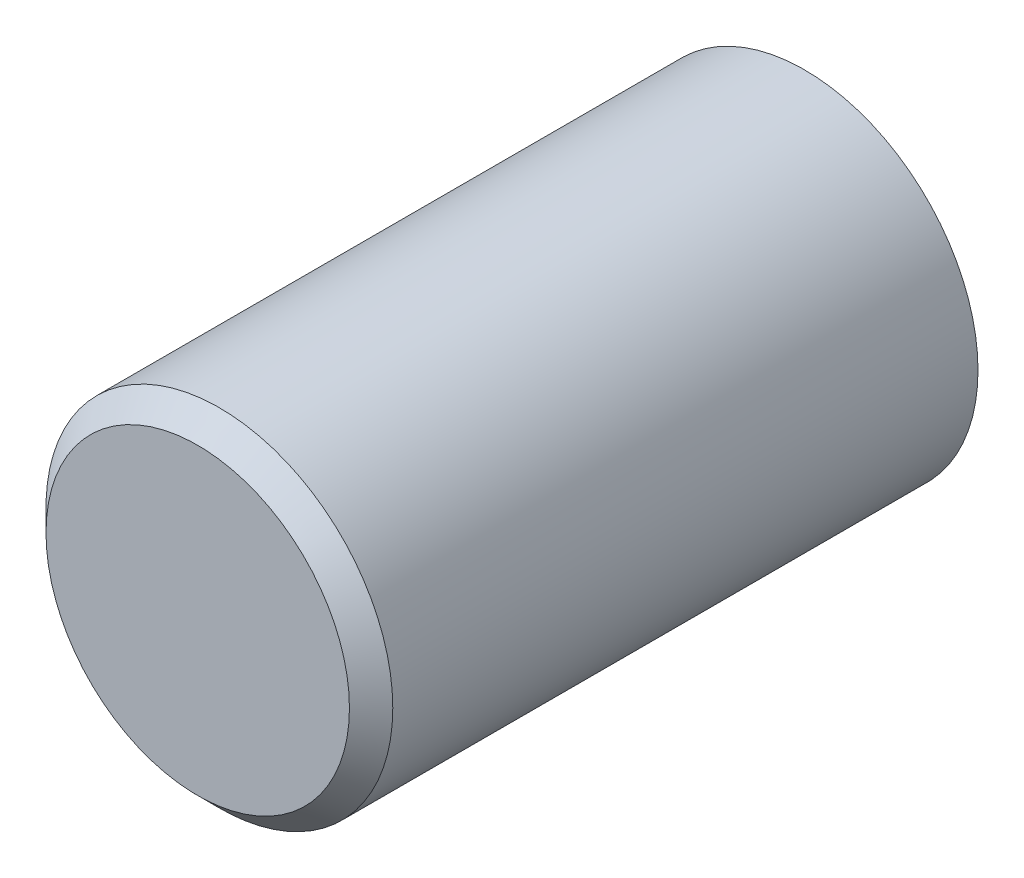
ISO-10303-21;
HEADER;
FILE_DESCRIPTION(('STEP AP214'),'2;1');
FILE_NAME('part.step','',(''),(''),'','','');
FILE_SCHEMA(('AUTOMOTIVE_DESIGN { 1 0 10303 214 1 1 1 1 }'));
ENDSEC;
DATA;
#1=APPLICATION_CONTEXT('core data for automotive mechanical design processes');
#2=APPLICATION_PROTOCOL_DEFINITION('international standard','automotive_design',2000,#1);
#3=PRODUCT_CONTEXT('',#1,'mechanical');
#4=PRODUCT('Part','Part','',(#3));
#5=PRODUCT_RELATED_PRODUCT_CATEGORY('part','',(#4));
#6=PRODUCT_DEFINITION_FORMATION('','',#4);
#7=PRODUCT_DEFINITION_CONTEXT('part definition',#1,'design');
#8=PRODUCT_DEFINITION('design','',#6,#7);
#9=PRODUCT_DEFINITION_SHAPE('','',#8);
#10=(LENGTH_UNIT() NAMED_UNIT(*) SI_UNIT(.MILLI.,.METRE.));
#11=(NAMED_UNIT(*) PLANE_ANGLE_UNIT() SI_UNIT($,.RADIAN.));
#12=(NAMED_UNIT(*) SI_UNIT($,.STERADIAN.) SOLID_ANGLE_UNIT());
#13=UNCERTAINTY_MEASURE_WITH_UNIT(LENGTH_MEASURE(1.E-05),#10,'distance_accuracy_value','');
#14=(GEOMETRIC_REPRESENTATION_CONTEXT(3) GLOBAL_UNCERTAINTY_ASSIGNED_CONTEXT((#13)) GLOBAL_UNIT_ASSIGNED_CONTEXT((#10,
#11,#12)) REPRESENTATION_CONTEXT('',''));
#15=CARTESIAN_POINT('',(0.,0.,0.));
#16=DIRECTION('',(0.,0.,1.));
#17=DIRECTION('',(1.,0.,0.));
#18=AXIS2_PLACEMENT_3D('',#15,#16,#17);
#19=CARTESIAN_POINT('',(0.,0.,14.));
#20=DIRECTION('',(0.,0.,-1.));
#21=DIRECTION('',(-1.,0.,0.));
#22=AXIS2_PLACEMENT_3D('',#19,#20,#21);
#23=CYLINDRICAL_SURFACE('',#22,4.);
#24=CARTESIAN_POINT('',(0.,0.,13.5));
#25=DIRECTION('',(0.,0.,1.));
#26=DIRECTION('',(1.,0.,0.));
#27=AXIS2_PLACEMENT_3D('',#24,#25,#26);
#28=CIRCLE('',#27,4.);
#29=CARTESIAN_POINT('',(4.,0.,13.5));
#30=VERTEX_POINT('',#29);
#31=EDGE_CURVE('E11',#30,#30,#28,.F.);
#32=ORIENTED_EDGE('',*,*,#31,.T.);
#33=EDGE_LOOP('',(#32));
#34=FACE_BOUND('',#33,.T.);
#35=CARTESIAN_POINT('',(0.,0.,0.));
#36=DIRECTION('',(0.,0.,1.));
#37=DIRECTION('',(1.,0.,0.));
#38=AXIS2_PLACEMENT_3D('',#35,#36,#37);
#39=CIRCLE('',#38,4.);
#40=CARTESIAN_POINT('',(4.,0.,0.));
#41=VERTEX_POINT('',#40);
#42=EDGE_CURVE('E58',#41,#41,#39,.T.);
#43=ORIENTED_EDGE('',*,*,#42,.T.);
#44=EDGE_LOOP('',(#43));
#45=FACE_BOUND('',#44,.T.);
#46=ADVANCED_FACE('F39',(#34,#45),#23,.T.);
#47=CARTESIAN_POINT('',(0.,0.,14.));
#48=DIRECTION('',(0.,0.,1.));
#49=DIRECTION('',(1.,0.,0.));
#50=AXIS2_PLACEMENT_3D('',#47,#48,#49);
#51=PLANE('',#50);
#52=CARTESIAN_POINT('',(0.,0.,14.));
#53=DIRECTION('',(0.,0.,1.));
#54=DIRECTION('',(1.,0.,0.));
#55=AXIS2_PLACEMENT_3D('',#52,#53,#54);
#56=CIRCLE('',#55,3.5);
#57=CARTESIAN_POINT('',(3.5,0.,14.));
#58=VERTEX_POINT('',#57);
#59=EDGE_CURVE('E46',#58,#58,#56,.T.);
#60=ORIENTED_EDGE('',*,*,#59,.T.);
#61=EDGE_LOOP('',(#60));
#62=FACE_BOUND('',#61,.T.);
#63=ADVANCED_FACE('F68',(#62),#51,.T.);
#64=CARTESIAN_POINT('',(0.,0.,0.));
#65=DIRECTION('',(0.,0.,1.));
#66=DIRECTION('',(1.,0.,0.));
#67=AXIS2_PLACEMENT_3D('',#64,#65,#66);
#68=PLANE('',#67);
#69=CARTESIAN_POINT('',(0.,0.,0.));
#70=DIRECTION('',(0.,0.,-1.));
#71=DIRECTION('',(-1.,0.,0.));
#72=AXIS2_PLACEMENT_3D('',#69,#70,#71);
#73=CIRCLE('',#72,1.65);
#74=CARTESIAN_POINT('',(-1.65,0.,0.));
#75=VERTEX_POINT('',#74);
#76=EDGE_CURVE('E59',#75,#75,#73,.T.);
#77=ORIENTED_EDGE('',*,*,#76,.F.);
#78=EDGE_LOOP('',(#77));
#79=FACE_BOUND('',#78,.T.);
#80=ORIENTED_EDGE('',*,*,#42,.F.);
#81=EDGE_LOOP('',(#80));
#82=FACE_BOUND('',#81,.T.);
#83=ADVANCED_FACE('F71',(#79,#82),#68,.F.);
#84=CARTESIAN_POINT('',(0.,0.,14.));
#85=DIRECTION('',(0.,0.,-1.));
#86=DIRECTION('',(-1.,0.,0.));
#87=AXIS2_PLACEMENT_3D('',#84,#85,#86);
#88=CONICAL_SURFACE('',#87,3.5,0.785398163397447);
#89=ORIENTED_EDGE('',*,*,#31,.F.);
#90=EDGE_LOOP('',(#89));
#91=FACE_BOUND('',#90,.T.);
#92=ORIENTED_EDGE('',*,*,#59,.F.);
#93=EDGE_LOOP('',(#92));
#94=FACE_BOUND('',#93,.T.);
#95=ADVANCED_FACE('F41',(#91,#94),#88,.T.);
#96=CARTESIAN_POINT('',(0.,0.,11.5));
#97=DIRECTION('',(0.,0.,-1.));
#98=DIRECTION('',(-1.,0.,0.));
#99=AXIS2_PLACEMENT_3D('',#96,#97,#98);
#100=CONICAL_SURFACE('',#99,1.65,1.02974425867665);
#101=CARTESIAN_POINT('',(0.,0.,12.4914200213955));
#102=VERTEX_POINT('',#101);
#103=VERTEX_LOOP('',#102);
#104=FACE_BOUND('',#103,.T.);
#105=CARTESIAN_POINT('',(0.,0.,11.5));
#106=DIRECTION('',(0.,0.,-1.));
#107=DIRECTION('',(-1.,0.,0.));
#108=AXIS2_PLACEMENT_3D('',#105,#106,#107);
#109=CIRCLE('',#108,1.65);
#110=CARTESIAN_POINT('',(-1.65,0.,11.5));
#111=VERTEX_POINT('',#110);
#112=EDGE_CURVE('E56',#111,#111,#109,.T.);
#113=ORIENTED_EDGE('',*,*,#112,.T.);
#114=EDGE_LOOP('',(#113));
#115=FACE_BOUND('',#114,.T.);
#116=ADVANCED_FACE('F49',(#104,#115),#100,.F.);
#117=CARTESIAN_POINT('',(0.,0.,0.));
#118=DIRECTION('',(0.,0.,-1.));
#119=DIRECTION('',(-1.,0.,0.));
#120=AXIS2_PLACEMENT_3D('',#117,#118,#119);
#121=CYLINDRICAL_SURFACE('',#120,1.65);
#122=ORIENTED_EDGE('',*,*,#112,.F.);
#123=EDGE_LOOP('',(#122));
#124=FACE_BOUND('',#123,.T.);
#125=ORIENTED_EDGE('',*,*,#76,.T.);
#126=EDGE_LOOP('',(#125));
#127=FACE_BOUND('',#126,.T.);
#128=ADVANCED_FACE('F52',(#124,#127),#121,.F.);
#129=CLOSED_SHELL('',(#46,#63,#83,#95,#116,#128));
#130=MANIFOLD_SOLID_BREP('B2',#129);
#131=ADVANCED_BREP_SHAPE_REPRESENTATION('',(#18,#130),#14);
#132=SHAPE_DEFINITION_REPRESENTATION(#9,#131);
ENDSEC;
END-ISO-10303-21;
